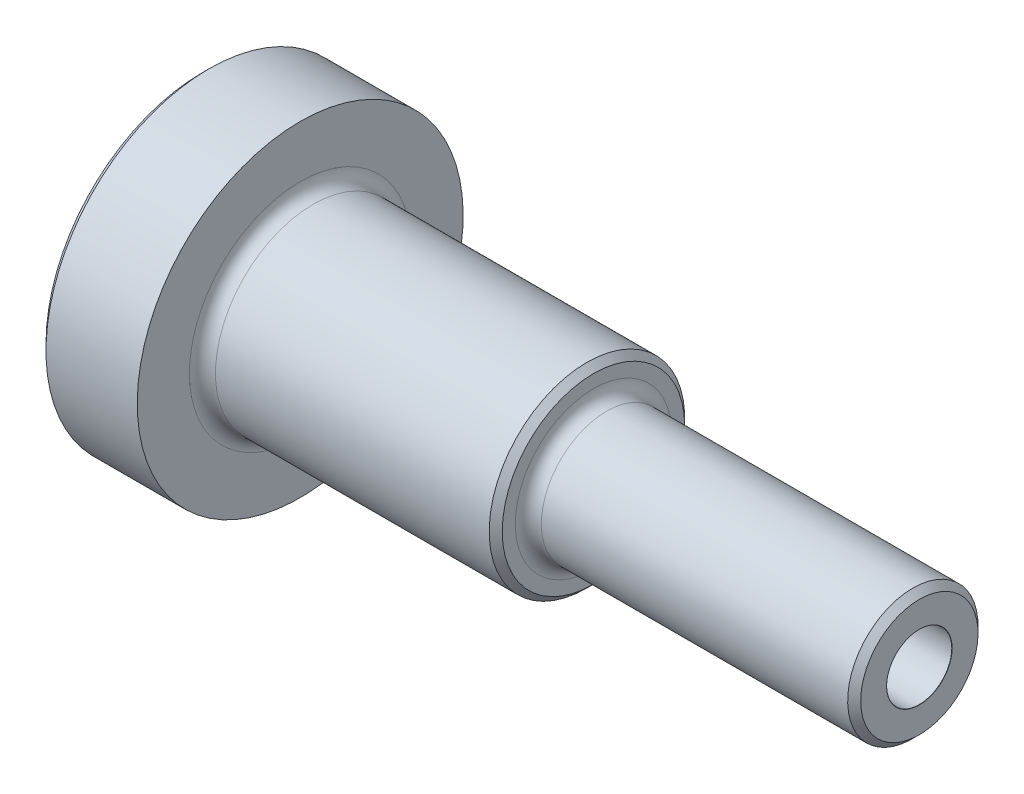
ISO-10303-21;
HEADER;
FILE_DESCRIPTION(('STEP AP214'),'2;1');
FILE_NAME('part.step','',(''),(''),'','','');
FILE_SCHEMA(('AUTOMOTIVE_DESIGN { 1 0 10303 214 1 1 1 1 }'));
ENDSEC;
DATA;
#1=APPLICATION_CONTEXT('core data for automotive mechanical design processes');
#2=APPLICATION_PROTOCOL_DEFINITION('international standard','automotive_design',2000,#1);
#3=PRODUCT_CONTEXT('',#1,'mechanical');
#4=PRODUCT('Part','Part','',(#3));
#5=PRODUCT_RELATED_PRODUCT_CATEGORY('part','',(#4));
#6=PRODUCT_DEFINITION_FORMATION('','',#4);
#7=PRODUCT_DEFINITION_CONTEXT('part definition',#1,'design');
#8=PRODUCT_DEFINITION('design','',#6,#7);
#9=PRODUCT_DEFINITION_SHAPE('','',#8);
#10=(LENGTH_UNIT() NAMED_UNIT(*) SI_UNIT(.MILLI.,.METRE.));
#11=(NAMED_UNIT(*) PLANE_ANGLE_UNIT() SI_UNIT($,.RADIAN.));
#12=(NAMED_UNIT(*) SI_UNIT($,.STERADIAN.) SOLID_ANGLE_UNIT());
#13=UNCERTAINTY_MEASURE_WITH_UNIT(LENGTH_MEASURE(1.E-05),#10,'distance_accuracy_value','');
#14=(GEOMETRIC_REPRESENTATION_CONTEXT(3) GLOBAL_UNCERTAINTY_ASSIGNED_CONTEXT((#13)) GLOBAL_UNIT_ASSIGNED_CONTEXT((#10,
#11,#12)) REPRESENTATION_CONTEXT('',''));
#15=CARTESIAN_POINT('',(0.,0.,0.));
#16=DIRECTION('',(0.,0.,1.));
#17=DIRECTION('',(1.,0.,0.));
#18=AXIS2_PLACEMENT_3D('',#15,#16,#17);
#19=CARTESIAN_POINT('',(0.,0.,0.));
#20=DIRECTION('',(-1.,0.,0.));
#21=DIRECTION('',(0.,-1.,0.));
#22=AXIS2_PLACEMENT_3D('',#19,#20,#21);
#23=PLANE('',#22);
#24=CARTESIAN_POINT('',(0.,0.,0.));
#25=DIRECTION('',(-1.,0.,0.));
#26=DIRECTION('',(0.,-1.,0.));
#27=AXIS2_PLACEMENT_3D('',#24,#25,#26);
#28=CIRCLE('',#27,5.99999999999998);
#29=CARTESIAN_POINT('',(0.,-5.99999999999998,0.));
#30=VERTEX_POINT('',#29);
#31=EDGE_CURVE('E53',#30,#30,#28,.F.);
#32=ORIENTED_EDGE('',*,*,#31,.T.);
#33=EDGE_LOOP('',(#32));
#34=FACE_BOUND('',#33,.T.);
#35=CARTESIAN_POINT('',(0.,0.,0.));
#36=DIRECTION('',(-1.,0.,0.));
#37=DIRECTION('',(0.,-1.,0.));
#38=AXIS2_PLACEMENT_3D('',#35,#36,#37);
#39=CIRCLE('',#38,24.);
#40=CARTESIAN_POINT('',(0.,-24.,0.));
#41=VERTEX_POINT('',#40);
#42=EDGE_CURVE('E58',#41,#41,#39,.T.);
#43=ORIENTED_EDGE('',*,*,#42,.T.);
#44=EDGE_LOOP('',(#43));
#45=FACE_BOUND('',#44,.T.);
#46=ADVANCED_FACE('F44',(#34,#45),#23,.T.);
#47=CARTESIAN_POINT('',(110.,0.,0.));
#48=DIRECTION('',(1.,0.,0.));
#49=DIRECTION('',(0.,1.,0.));
#50=AXIS2_PLACEMENT_3D('',#47,#48,#49);
#51=CYLINDRICAL_SURFACE('',#50,25.);
#52=CARTESIAN_POINT('',(1.00000000000001,0.,0.));
#53=DIRECTION('',(-1.,0.,0.));
#54=DIRECTION('',(0.,-1.,0.));
#55=AXIS2_PLACEMENT_3D('',#52,#53,#54);
#56=CIRCLE('',#55,25.);
#57=CARTESIAN_POINT('',(1.00000000000001,-25.,0.));
#58=VERTEX_POINT('',#57);
#59=EDGE_CURVE('E63',#58,#58,#56,.F.);
#60=ORIENTED_EDGE('',*,*,#59,.T.);
#61=EDGE_LOOP('',(#60));
#62=FACE_BOUND('',#61,.T.);
#63=CARTESIAN_POINT('',(15.,0.,0.));
#64=DIRECTION('',(1.,0.,0.));
#65=DIRECTION('',(0.,1.,0.));
#66=AXIS2_PLACEMENT_3D('',#63,#64,#65);
#67=CIRCLE('',#66,25.);
#68=CARTESIAN_POINT('',(15.,25.,0.));
#69=VERTEX_POINT('',#68);
#70=EDGE_CURVE('E101',#69,#69,#67,.T.);
#71=ORIENTED_EDGE('',*,*,#70,.F.);
#72=EDGE_LOOP('',(#71));
#73=FACE_BOUND('',#72,.T.);
#74=ADVANCED_FACE('F132',(#62,#73),#51,.T.);
#75=CARTESIAN_POINT('',(15.,25.,0.));
#76=DIRECTION('',(1.,0.,0.));
#77=DIRECTION('',(0.,1.,0.));
#78=AXIS2_PLACEMENT_3D('',#75,#76,#77);
#79=PLANE('',#78);
#80=CARTESIAN_POINT('',(15.,0.,0.));
#81=DIRECTION('',(1.,0.,0.));
#82=DIRECTION('',(0.,1.,0.));
#83=AXIS2_PLACEMENT_3D('',#80,#81,#82);
#84=CIRCLE('',#83,17.);
#85=CARTESIAN_POINT('',(15.,17.,0.));
#86=VERTEX_POINT('',#85);
#87=EDGE_CURVE('E85',#86,#86,#84,.F.);
#88=ORIENTED_EDGE('',*,*,#87,.T.);
#89=EDGE_LOOP('',(#88));
#90=FACE_BOUND('',#89,.T.);
#91=ORIENTED_EDGE('',*,*,#70,.T.);
#92=EDGE_LOOP('',(#91));
#93=FACE_BOUND('',#92,.T.);
#94=ADVANCED_FACE('F138',(#90,#93),#79,.T.);
#95=CARTESIAN_POINT('',(110.,0.,0.));
#96=DIRECTION('',(1.,0.,0.));
#97=DIRECTION('',(0.,1.,0.));
#98=AXIS2_PLACEMENT_3D('',#95,#96,#97);
#99=CYLINDRICAL_SURFACE('',#98,15.);
#100=CARTESIAN_POINT('',(59.,0.,0.));
#101=DIRECTION('',(1.,0.,0.));
#102=DIRECTION('',(0.,1.,0.));
#103=AXIS2_PLACEMENT_3D('',#100,#101,#102);
#104=CIRCLE('',#103,15.);
#105=CARTESIAN_POINT('',(59.,15.,0.));
#106=VERTEX_POINT('',#105);
#107=EDGE_CURVE('E69',#106,#106,#104,.F.);
#108=ORIENTED_EDGE('',*,*,#107,.T.);
#109=EDGE_LOOP('',(#108));
#110=FACE_BOUND('',#109,.T.);
#111=CARTESIAN_POINT('',(17.,0.,0.));
#112=DIRECTION('',(1.,0.,0.));
#113=DIRECTION('',(0.,1.,0.));
#114=AXIS2_PLACEMENT_3D('',#111,#112,#113);
#115=CIRCLE('',#114,15.);
#116=CARTESIAN_POINT('',(17.,15.,0.));
#117=VERTEX_POINT('',#116);
#118=EDGE_CURVE('E89',#117,#117,#115,.T.);
#119=ORIENTED_EDGE('',*,*,#118,.T.);
#120=EDGE_LOOP('',(#119));
#121=FACE_BOUND('',#120,.T.);
#122=ADVANCED_FACE('F180',(#110,#121),#99,.T.);
#123=CARTESIAN_POINT('',(60.,15.,0.));
#124=DIRECTION('',(1.,0.,0.));
#125=DIRECTION('',(0.,1.,0.));
#126=AXIS2_PLACEMENT_3D('',#123,#124,#125);
#127=PLANE('',#126);
#128=CARTESIAN_POINT('',(60.,0.,0.));
#129=DIRECTION('',(1.,0.,0.));
#130=DIRECTION('',(0.,1.,0.));
#131=AXIS2_PLACEMENT_3D('',#128,#129,#130);
#132=CIRCLE('',#131,14.);
#133=CARTESIAN_POINT('',(60.,14.,0.));
#134=VERTEX_POINT('',#133);
#135=EDGE_CURVE('E73',#134,#134,#132,.T.);
#136=ORIENTED_EDGE('',*,*,#135,.T.);
#137=EDGE_LOOP('',(#136));
#138=FACE_BOUND('',#137,.T.);
#139=CARTESIAN_POINT('',(60.,0.,0.));
#140=DIRECTION('',(1.,0.,0.));
#141=DIRECTION('',(0.,1.,0.));
#142=AXIS2_PLACEMENT_3D('',#139,#140,#141);
#143=CIRCLE('',#142,12.);
#144=CARTESIAN_POINT('',(60.,12.,0.));
#145=VERTEX_POINT('',#144);
#146=EDGE_CURVE('E93',#145,#145,#143,.F.);
#147=ORIENTED_EDGE('',*,*,#146,.T.);
#148=EDGE_LOOP('',(#147));
#149=FACE_BOUND('',#148,.T.);
#150=ADVANCED_FACE('F128',(#138,#149),#127,.T.);
#151=CARTESIAN_POINT('',(110.,0.,0.));
#152=DIRECTION('',(1.,0.,0.));
#153=DIRECTION('',(0.,1.,0.));
#154=AXIS2_PLACEMENT_3D('',#151,#152,#153);
#155=CYLINDRICAL_SURFACE('',#154,10.);
#156=CARTESIAN_POINT('',(109.,0.,0.));
#157=DIRECTION('',(1.,0.,0.));
#158=DIRECTION('',(0.,1.,0.));
#159=AXIS2_PLACEMENT_3D('',#156,#157,#158);
#160=CIRCLE('',#159,10.);
#161=CARTESIAN_POINT('',(109.,9.99999999999999,0.));
#162=VERTEX_POINT('',#161);
#163=EDGE_CURVE('E77',#162,#162,#160,.F.);
#164=ORIENTED_EDGE('',*,*,#163,.T.);
#165=EDGE_LOOP('',(#164));
#166=FACE_BOUND('',#165,.T.);
#167=CARTESIAN_POINT('',(62.,0.,0.));
#168=DIRECTION('',(1.,0.,0.));
#169=DIRECTION('',(0.,1.,0.));
#170=AXIS2_PLACEMENT_3D('',#167,#168,#169);
#171=CIRCLE('',#170,10.);
#172=CARTESIAN_POINT('',(62.,10.,0.));
#173=VERTEX_POINT('',#172);
#174=EDGE_CURVE('E97',#173,#173,#171,.T.);
#175=ORIENTED_EDGE('',*,*,#174,.T.);
#176=EDGE_LOOP('',(#175));
#177=FACE_BOUND('',#176,.T.);
#178=ADVANCED_FACE('F119',(#166,#177),#155,.T.);
#179=CARTESIAN_POINT('',(110.,9.99999999999999,0.));
#180=DIRECTION('',(1.,0.,0.));
#181=DIRECTION('',(0.,1.,0.));
#182=AXIS2_PLACEMENT_3D('',#179,#180,#181);
#183=PLANE('',#182);
#184=CARTESIAN_POINT('',(110.,0.,0.));
#185=DIRECTION('',(1.,0.,0.));
#186=DIRECTION('',(0.,1.,0.));
#187=AXIS2_PLACEMENT_3D('',#184,#185,#186);
#188=CIRCLE('',#187,8.99999999999995);
#189=CARTESIAN_POINT('',(110.,8.99999999999995,0.));
#190=VERTEX_POINT('',#189);
#191=EDGE_CURVE('E81',#190,#190,#188,.T.);
#192=ORIENTED_EDGE('',*,*,#191,.T.);
#193=EDGE_LOOP('',(#192));
#194=FACE_BOUND('',#193,.T.);
#195=CARTESIAN_POINT('',(110.,0.,0.));
#196=DIRECTION('',(1.,0.,0.));
#197=DIRECTION('',(0.,0.,-1.));
#198=AXIS2_PLACEMENT_3D('',#195,#196,#197);
#199=CIRCLE('',#198,5.025);
#200=CARTESIAN_POINT('',(110.,0.,-5.025));
#201=VERTEX_POINT('',#200);
#202=EDGE_CURVE('E109',#201,#201,#199,.T.);
#203=ORIENTED_EDGE('',*,*,#202,.F.);
#204=EDGE_LOOP('',(#203));
#205=FACE_BOUND('',#204,.T.);
#206=ADVANCED_FACE('F116',(#194,#205),#183,.T.);
#207=CARTESIAN_POINT('',(110.,0.,0.));
#208=DIRECTION('',(1.,0.,0.));
#209=DIRECTION('',(0.,0.,-1.));
#210=AXIS2_PLACEMENT_3D('',#207,#208,#209);
#211=CYLINDRICAL_SURFACE('',#210,4.99999999999999);
#212=CARTESIAN_POINT('',(0.999999999999987,0.,0.));
#213=DIRECTION('',(-1.,0.,0.));
#214=DIRECTION('',(0.,0.,1.));
#215=AXIS2_PLACEMENT_3D('',#212,#213,#214);
#216=CIRCLE('',#215,4.99999999999999);
#217=CARTESIAN_POINT('',(0.999999999999987,0.,4.99999999999999));
#218=VERTEX_POINT('',#217);
#219=EDGE_CURVE('E10',#218,#218,#216,.T.);
#220=ORIENTED_EDGE('',*,*,#219,.T.);
#221=EDGE_LOOP('',(#220));
#222=FACE_BOUND('',#221,.T.);
#223=CARTESIAN_POINT('',(109.975,0.,0.));
#224=DIRECTION('',(1.,0.,0.));
#225=DIRECTION('',(0.,0.,-1.));
#226=AXIS2_PLACEMENT_3D('',#223,#224,#225);
#227=CIRCLE('',#226,5.);
#228=CARTESIAN_POINT('',(109.975,0.,-5.));
#229=VERTEX_POINT('',#228);
#230=EDGE_CURVE('E105',#229,#229,#227,.T.);
#231=ORIENTED_EDGE('',*,*,#230,.T.);
#232=EDGE_LOOP('',(#231));
#233=FACE_BOUND('',#232,.T.);
#234=ADVANCED_FACE('F118',(#222,#233),#211,.F.);
#235=CARTESIAN_POINT('',(110.,0.,0.));
#236=DIRECTION('',(1.,0.,0.));
#237=DIRECTION('',(0.,0.,-1.));
#238=AXIS2_PLACEMENT_3D('',#235,#236,#237);
#239=CONICAL_SURFACE('',#238,5.025,0.78539816339724);
#240=ORIENTED_EDGE('',*,*,#230,.F.);
#241=EDGE_LOOP('',(#240));
#242=FACE_BOUND('',#241,.T.);
#243=ORIENTED_EDGE('',*,*,#202,.T.);
#244=EDGE_LOOP('',(#243));
#245=FACE_BOUND('',#244,.T.);
#246=ADVANCED_FACE('F114',(#242,#245),#239,.F.);
#247=CARTESIAN_POINT('',(62.,0.,0.));
#248=DIRECTION('',(1.,0.,0.));
#249=DIRECTION('',(0.,1.,0.));
#250=AXIS2_PLACEMENT_3D('',#247,#248,#249);
#251=TOROIDAL_SURFACE('',#250,12.,2.);
#252=ORIENTED_EDGE('',*,*,#146,.F.);
#253=EDGE_LOOP('',(#252));
#254=FACE_BOUND('',#253,.T.);
#255=ORIENTED_EDGE('',*,*,#174,.F.);
#256=EDGE_LOOP('',(#255));
#257=FACE_BOUND('',#256,.T.);
#258=ADVANCED_FACE('F144',(#254,#257),#251,.F.);
#259=CARTESIAN_POINT('',(17.,0.,0.));
#260=DIRECTION('',(1.,0.,0.));
#261=DIRECTION('',(0.,1.,0.));
#262=AXIS2_PLACEMENT_3D('',#259,#260,#261);
#263=TOROIDAL_SURFACE('',#262,17.,2.);
#264=ORIENTED_EDGE('',*,*,#87,.F.);
#265=EDGE_LOOP('',(#264));
#266=FACE_BOUND('',#265,.T.);
#267=ORIENTED_EDGE('',*,*,#118,.F.);
#268=EDGE_LOOP('',(#267));
#269=FACE_BOUND('',#268,.T.);
#270=ADVANCED_FACE('F147',(#266,#269),#263,.F.);
#271=CARTESIAN_POINT('',(110.,0.,0.));
#272=DIRECTION('',(-1.,0.,0.));
#273=DIRECTION('',(0.,-1.,0.));
#274=AXIS2_PLACEMENT_3D('',#271,#272,#273);
#275=CONICAL_SURFACE('',#274,8.99999999999995,0.785398163397444);
#276=ORIENTED_EDGE('',*,*,#163,.F.);
#277=EDGE_LOOP('',(#276));
#278=FACE_BOUND('',#277,.T.);
#279=ORIENTED_EDGE('',*,*,#191,.F.);
#280=EDGE_LOOP('',(#279));
#281=FACE_BOUND('',#280,.T.);
#282=ADVANCED_FACE('F151',(#278,#281),#275,.T.);
#283=CARTESIAN_POINT('',(60.,0.,0.));
#284=DIRECTION('',(-1.,0.,0.));
#285=DIRECTION('',(0.,-1.,0.));
#286=AXIS2_PLACEMENT_3D('',#283,#284,#285);
#287=CONICAL_SURFACE('',#286,14.,0.78539816339745);
#288=ORIENTED_EDGE('',*,*,#107,.F.);
#289=EDGE_LOOP('',(#288));
#290=FACE_BOUND('',#289,.T.);
#291=ORIENTED_EDGE('',*,*,#135,.F.);
#292=EDGE_LOOP('',(#291));
#293=FACE_BOUND('',#292,.T.);
#294=ADVANCED_FACE('F158',(#290,#293),#287,.T.);
#295=CARTESIAN_POINT('',(1.00000000000001,0.,0.));
#296=DIRECTION('',(1.,0.,0.));
#297=DIRECTION('',(0.,1.,0.));
#298=AXIS2_PLACEMENT_3D('',#295,#296,#297);
#299=CONICAL_SURFACE('',#298,25.,0.785398163397453);
#300=ORIENTED_EDGE('',*,*,#42,.F.);
#301=EDGE_LOOP('',(#300));
#302=FACE_BOUND('',#301,.T.);
#303=ORIENTED_EDGE('',*,*,#59,.F.);
#304=EDGE_LOOP('',(#303));
#305=FACE_BOUND('',#304,.T.);
#306=ADVANCED_FACE('F164',(#302,#305),#299,.T.);
#307=CARTESIAN_POINT('',(0.,0.,0.));
#308=DIRECTION('',(-1.,0.,0.));
#309=DIRECTION('',(0.,0.,1.));
#310=AXIS2_PLACEMENT_3D('',#307,#308,#309);
#311=CONICAL_SURFACE('',#310,5.99999999999998,0.785398163397447);
#312=ORIENTED_EDGE('',*,*,#219,.F.);
#313=EDGE_LOOP('',(#312));
#314=FACE_BOUND('',#313,.T.);
#315=ORIENTED_EDGE('',*,*,#31,.F.);
#316=EDGE_LOOP('',(#315));
#317=FACE_BOUND('',#316,.T.);
#318=ADVANCED_FACE('F47',(#314,#317),#311,.F.);
#319=CLOSED_SHELL('',(#46,#74,#94,#122,#150,#178,#206,#234,#246,#258,#270,#282,#294,#306,#318));
#320=MANIFOLD_SOLID_BREP('B2',#319);
#321=ADVANCED_BREP_SHAPE_REPRESENTATION('',(#18,#320),#14);
#322=SHAPE_DEFINITION_REPRESENTATION(#9,#321);
ENDSEC;
END-ISO-10303-21;
